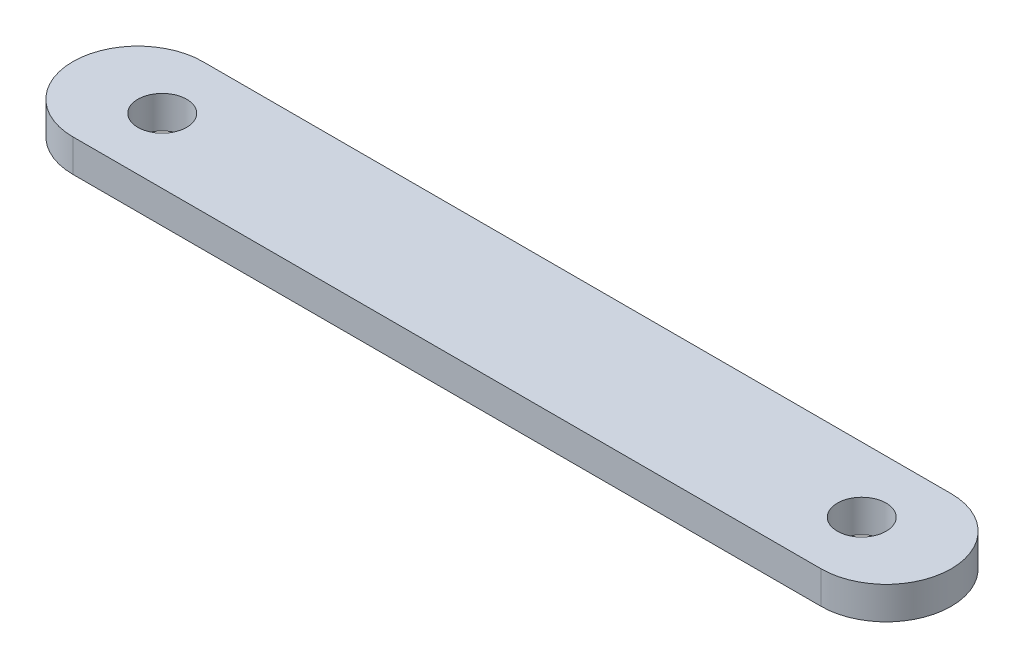
ISO-10303-21;
HEADER;
FILE_DESCRIPTION(('STEP AP214'),'2;1');
FILE_NAME('part.step','',(''),(''),'','','');
FILE_SCHEMA(('AUTOMOTIVE_DESIGN { 1 0 10303 214 1 1 1 1 }'));
ENDSEC;
DATA;
#1=APPLICATION_CONTEXT('core data for automotive mechanical design processes');
#2=APPLICATION_PROTOCOL_DEFINITION('international standard','automotive_design',2000,#1);
#3=PRODUCT_CONTEXT('',#1,'mechanical');
#4=PRODUCT('Part','Part','',(#3));
#5=PRODUCT_RELATED_PRODUCT_CATEGORY('part','',(#4));
#6=PRODUCT_DEFINITION_FORMATION('','',#4);
#7=PRODUCT_DEFINITION_CONTEXT('part definition',#1,'design');
#8=PRODUCT_DEFINITION('design','',#6,#7);
#9=PRODUCT_DEFINITION_SHAPE('','',#8);
#10=(LENGTH_UNIT() NAMED_UNIT(*) SI_UNIT(.MILLI.,.METRE.));
#11=(NAMED_UNIT(*) PLANE_ANGLE_UNIT() SI_UNIT($,.RADIAN.));
#12=(NAMED_UNIT(*) SI_UNIT($,.STERADIAN.) SOLID_ANGLE_UNIT());
#13=UNCERTAINTY_MEASURE_WITH_UNIT(LENGTH_MEASURE(1.E-05),#10,'distance_accuracy_value','');
#14=(GEOMETRIC_REPRESENTATION_CONTEXT(3) GLOBAL_UNCERTAINTY_ASSIGNED_CONTEXT((#13)) GLOBAL_UNIT_ASSIGNED_CONTEXT((#10,
#11,#12)) REPRESENTATION_CONTEXT('',''));
#15=CARTESIAN_POINT('',(0.,0.,0.));
#16=DIRECTION('',(0.,0.,1.));
#17=DIRECTION('',(1.,0.,0.));
#18=AXIS2_PLACEMENT_3D('',#15,#16,#17);
#19=CARTESIAN_POINT('',(-1150.,100.,0.));
#20=DIRECTION('',(0.,-1.,0.));
#21=DIRECTION('',(0.,0.,-1.));
#22=AXIS2_PLACEMENT_3D('',#19,#20,#21);
#23=CYLINDRICAL_SURFACE('',#22,200.);
#24=CARTESIAN_POINT('',(-1150.,0.,0.));
#25=DIRECTION('',(0.,1.,0.));
#26=DIRECTION('',(0.,0.,1.));
#27=AXIS2_PLACEMENT_3D('',#24,#25,#26);
#28=CIRCLE('',#27,200.);
#29=CARTESIAN_POINT('',(-1150.,0.,-200.));
#30=VERTEX_POINT('',#29);
#31=CARTESIAN_POINT('',(-1150.,0.,200.));
#32=VERTEX_POINT('',#31);
#33=EDGE_CURVE('E121',#30,#32,#28,.T.);
#34=ORIENTED_EDGE('',*,*,#33,.T.);
#35=DIRECTION('',(0.,-1.,0.));
#36=VECTOR('',#35,1.);
#37=CARTESIAN_POINT('',(-1150.,100.,200.));
#38=LINE('',#37,#36);
#39=CARTESIAN_POINT('',(-1150.,100.,200.));
#40=VERTEX_POINT('',#39);
#41=EDGE_CURVE('E11',#40,#32,#38,.T.);
#42=ORIENTED_EDGE('',*,*,#41,.F.);
#43=CARTESIAN_POINT('',(-1150.,100.,0.));
#44=DIRECTION('',(0.,1.,0.));
#45=DIRECTION('',(0.,0.,1.));
#46=AXIS2_PLACEMENT_3D('',#43,#44,#45);
#47=CIRCLE('',#46,200.);
#48=CARTESIAN_POINT('',(-1150.,100.,-200.));
#49=VERTEX_POINT('',#48);
#50=EDGE_CURVE('E86',#49,#40,#47,.T.);
#51=ORIENTED_EDGE('',*,*,#50,.F.);
#52=DIRECTION('',(0.,-1.,0.));
#53=VECTOR('',#52,1.);
#54=CARTESIAN_POINT('',(-1150.,100.,-200.));
#55=LINE('',#54,#53);
#56=EDGE_CURVE('E109',#49,#30,#55,.T.);
#57=ORIENTED_EDGE('',*,*,#56,.T.);
#58=EDGE_LOOP('',(#34,#42,#51,#57));
#59=FACE_BOUND('',#58,.T.);
#60=ADVANCED_FACE('F45',(#59),#23,.T.);
#61=CARTESIAN_POINT('',(0.,100.,200.));
#62=DIRECTION('',(0.,0.,1.));
#63=DIRECTION('',(1.,0.,0.));
#64=AXIS2_PLACEMENT_3D('',#61,#62,#63);
#65=PLANE('',#64);
#66=DIRECTION('',(-1.,0.,0.));
#67=VECTOR('',#66,1.);
#68=CARTESIAN_POINT('',(0.,0.,200.));
#69=LINE('',#68,#67);
#70=CARTESIAN_POINT('',(1150.,0.,200.));
#71=VERTEX_POINT('',#70);
#72=EDGE_CURVE('E95',#71,#32,#69,.T.);
#73=ORIENTED_EDGE('',*,*,#72,.F.);
#74=DIRECTION('',(0.,-1.,0.));
#75=VECTOR('',#74,1.);
#76=CARTESIAN_POINT('',(1150.,100.,200.));
#77=LINE('',#76,#75);
#78=CARTESIAN_POINT('',(1150.,100.,200.));
#79=VERTEX_POINT('',#78);
#80=EDGE_CURVE('E55',#79,#71,#77,.T.);
#81=ORIENTED_EDGE('',*,*,#80,.F.);
#82=DIRECTION('',(-1.,0.,0.));
#83=VECTOR('',#82,1.);
#84=CARTESIAN_POINT('',(0.,100.,200.));
#85=LINE('',#84,#83);
#86=EDGE_CURVE('E93',#79,#40,#85,.T.);
#87=ORIENTED_EDGE('',*,*,#86,.T.);
#88=ORIENTED_EDGE('',*,*,#41,.T.);
#89=EDGE_LOOP('',(#73,#81,#87,#88));
#90=FACE_BOUND('',#89,.T.);
#91=ADVANCED_FACE('F92',(#90),#65,.T.);
#92=CARTESIAN_POINT('',(1150.,100.,-2.22044604925031E-13));
#93=DIRECTION('',(0.,-1.,0.));
#94=DIRECTION('',(0.,0.,-1.));
#95=AXIS2_PLACEMENT_3D('',#92,#93,#94);
#96=CYLINDRICAL_SURFACE('',#95,200.);
#97=CARTESIAN_POINT('',(1150.,0.,-2.22044604925031E-13));
#98=DIRECTION('',(0.,1.,0.));
#99=DIRECTION('',(0.,0.,1.));
#100=AXIS2_PLACEMENT_3D('',#97,#98,#99);
#101=CIRCLE('',#100,200.);
#102=CARTESIAN_POINT('',(1150.,0.,-200.));
#103=VERTEX_POINT('',#102);
#104=EDGE_CURVE('E127',#103,#71,#101,.F.);
#105=ORIENTED_EDGE('',*,*,#104,.F.);
#106=DIRECTION('',(0.,-1.,0.));
#107=VECTOR('',#106,1.);
#108=CARTESIAN_POINT('',(1150.,100.,-200.));
#109=LINE('',#108,#107);
#110=CARTESIAN_POINT('',(1150.,100.,-200.));
#111=VERTEX_POINT('',#110);
#112=EDGE_CURVE('E78',#111,#103,#109,.T.);
#113=ORIENTED_EDGE('',*,*,#112,.F.);
#114=CARTESIAN_POINT('',(1150.,100.,-2.22044604925031E-13));
#115=DIRECTION('',(0.,1.,0.));
#116=DIRECTION('',(0.,0.,1.));
#117=AXIS2_PLACEMENT_3D('',#114,#115,#116);
#118=CIRCLE('',#117,200.);
#119=EDGE_CURVE('E102',#111,#79,#118,.F.);
#120=ORIENTED_EDGE('',*,*,#119,.T.);
#121=ORIENTED_EDGE('',*,*,#80,.T.);
#122=EDGE_LOOP('',(#105,#113,#120,#121));
#123=FACE_BOUND('',#122,.T.);
#124=ADVANCED_FACE('F105',(#123),#96,.T.);
#125=CARTESIAN_POINT('',(-1075.,100.,0.));
#126=DIRECTION('',(0.,-1.,0.));
#127=DIRECTION('',(0.,0.,-1.));
#128=AXIS2_PLACEMENT_3D('',#125,#126,#127);
#129=CYLINDRICAL_SURFACE('',#128,75.);
#130=CARTESIAN_POINT('',(-1075.,100.,0.));
#131=DIRECTION('',(0.,1.,0.));
#132=DIRECTION('',(0.,0.,1.));
#133=AXIS2_PLACEMENT_3D('',#130,#131,#132);
#134=CIRCLE('',#133,75.);
#135=CARTESIAN_POINT('',(-1075.,100.,75.0000000000001));
#136=VERTEX_POINT('',#135);
#137=EDGE_CURVE('E170',#136,#136,#134,.T.);
#138=ORIENTED_EDGE('',*,*,#137,.T.);
#139=EDGE_LOOP('',(#138));
#140=FACE_BOUND('',#139,.T.);
#141=CARTESIAN_POINT('',(-1075.,0.,0.));
#142=DIRECTION('',(0.,1.,0.));
#143=DIRECTION('',(0.,0.,1.));
#144=AXIS2_PLACEMENT_3D('',#141,#142,#143);
#145=CIRCLE('',#144,75.);
#146=CARTESIAN_POINT('',(-1075.,0.,75.0000000000001));
#147=VERTEX_POINT('',#146);
#148=EDGE_CURVE('E117',#147,#147,#145,.T.);
#149=ORIENTED_EDGE('',*,*,#148,.F.);
#150=EDGE_LOOP('',(#149));
#151=FACE_BOUND('',#150,.T.);
#152=ADVANCED_FACE('F159',(#140,#151),#129,.F.);
#153=CARTESIAN_POINT('',(1075.,100.,0.));
#154=DIRECTION('',(0.,-1.,0.));
#155=DIRECTION('',(0.,0.,-1.));
#156=AXIS2_PLACEMENT_3D('',#153,#154,#155);
#157=CYLINDRICAL_SURFACE('',#156,75.);
#158=CARTESIAN_POINT('',(1075.,100.,0.));
#159=DIRECTION('',(0.,1.,0.));
#160=DIRECTION('',(0.,0.,1.));
#161=AXIS2_PLACEMENT_3D('',#158,#159,#160);
#162=CIRCLE('',#161,75.);
#163=CARTESIAN_POINT('',(1075.,100.,75.0000000000001));
#164=VERTEX_POINT('',#163);
#165=EDGE_CURVE('E132',#164,#164,#162,.F.);
#166=ORIENTED_EDGE('',*,*,#165,.F.);
#167=EDGE_LOOP('',(#166));
#168=FACE_BOUND('',#167,.T.);
#169=CARTESIAN_POINT('',(1075.,0.,0.));
#170=DIRECTION('',(0.,1.,0.));
#171=DIRECTION('',(0.,0.,1.));
#172=AXIS2_PLACEMENT_3D('',#169,#170,#171);
#173=CIRCLE('',#172,75.);
#174=CARTESIAN_POINT('',(1075.,0.,75.0000000000001));
#175=VERTEX_POINT('',#174);
#176=EDGE_CURVE('E113',#175,#175,#173,.F.);
#177=ORIENTED_EDGE('',*,*,#176,.T.);
#178=EDGE_LOOP('',(#177));
#179=FACE_BOUND('',#178,.T.);
#180=ADVANCED_FACE('F47',(#168,#179),#157,.F.);
#181=CARTESIAN_POINT('',(0.,100.,-200.));
#182=DIRECTION('',(0.,0.,1.));
#183=DIRECTION('',(1.,0.,0.));
#184=AXIS2_PLACEMENT_3D('',#181,#182,#183);
#185=PLANE('',#184);
#186=DIRECTION('',(-1.,0.,0.));
#187=VECTOR('',#186,1.);
#188=CARTESIAN_POINT('',(0.,0.,-200.));
#189=LINE('',#188,#187);
#190=EDGE_CURVE('E81',#103,#30,#189,.T.);
#191=ORIENTED_EDGE('',*,*,#190,.T.);
#192=ORIENTED_EDGE('',*,*,#56,.F.);
#193=DIRECTION('',(-1.,0.,0.));
#194=VECTOR('',#193,1.);
#195=CARTESIAN_POINT('',(0.,100.,-200.));
#196=LINE('',#195,#194);
#197=EDGE_CURVE('E63',#111,#49,#196,.T.);
#198=ORIENTED_EDGE('',*,*,#197,.F.);
#199=ORIENTED_EDGE('',*,*,#112,.T.);
#200=EDGE_LOOP('',(#191,#192,#198,#199));
#201=FACE_BOUND('',#200,.T.);
#202=ADVANCED_FACE('F146',(#201),#185,.F.);
#203=CARTESIAN_POINT('',(0.,100.,0.));
#204=DIRECTION('',(0.,1.,0.));
#205=DIRECTION('',(0.,0.,1.));
#206=AXIS2_PLACEMENT_3D('',#203,#204,#205);
#207=PLANE('',#206);
#208=ORIENTED_EDGE('',*,*,#165,.T.);
#209=EDGE_LOOP('',(#208));
#210=FACE_BOUND('',#209,.T.);
#211=ORIENTED_EDGE('',*,*,#137,.F.);
#212=EDGE_LOOP('',(#211));
#213=FACE_BOUND('',#212,.T.);
#214=ORIENTED_EDGE('',*,*,#50,.T.);
#215=ORIENTED_EDGE('',*,*,#86,.F.);
#216=ORIENTED_EDGE('',*,*,#119,.F.);
#217=ORIENTED_EDGE('',*,*,#197,.T.);
#218=EDGE_LOOP('',(#214,#215,#216,#217));
#219=FACE_BOUND('',#218,.T.);
#220=ADVANCED_FACE('F101',(#210,#213,#219),#207,.T.);
#221=CARTESIAN_POINT('',(0.,0.,0.));
#222=DIRECTION('',(0.,1.,0.));
#223=DIRECTION('',(0.,0.,1.));
#224=AXIS2_PLACEMENT_3D('',#221,#222,#223);
#225=PLANE('',#224);
#226=ORIENTED_EDGE('',*,*,#176,.F.);
#227=EDGE_LOOP('',(#226));
#228=FACE_BOUND('',#227,.T.);
#229=ORIENTED_EDGE('',*,*,#148,.T.);
#230=EDGE_LOOP('',(#229));
#231=FACE_BOUND('',#230,.T.);
#232=ORIENTED_EDGE('',*,*,#33,.F.);
#233=ORIENTED_EDGE('',*,*,#190,.F.);
#234=ORIENTED_EDGE('',*,*,#104,.T.);
#235=ORIENTED_EDGE('',*,*,#72,.T.);
#236=EDGE_LOOP('',(#232,#233,#234,#235));
#237=FACE_BOUND('',#236,.T.);
#238=ADVANCED_FACE('F139',(#228,#231,#237),#225,.F.);
#239=CLOSED_SHELL('',(#60,#91,#124,#152,#180,#202,#220,#238));
#240=MANIFOLD_SOLID_BREP('B2',#239);
#241=ADVANCED_BREP_SHAPE_REPRESENTATION('',(#18,#240),#14);
#242=SHAPE_DEFINITION_REPRESENTATION(#9,#241);
ENDSEC;
END-ISO-10303-21;
